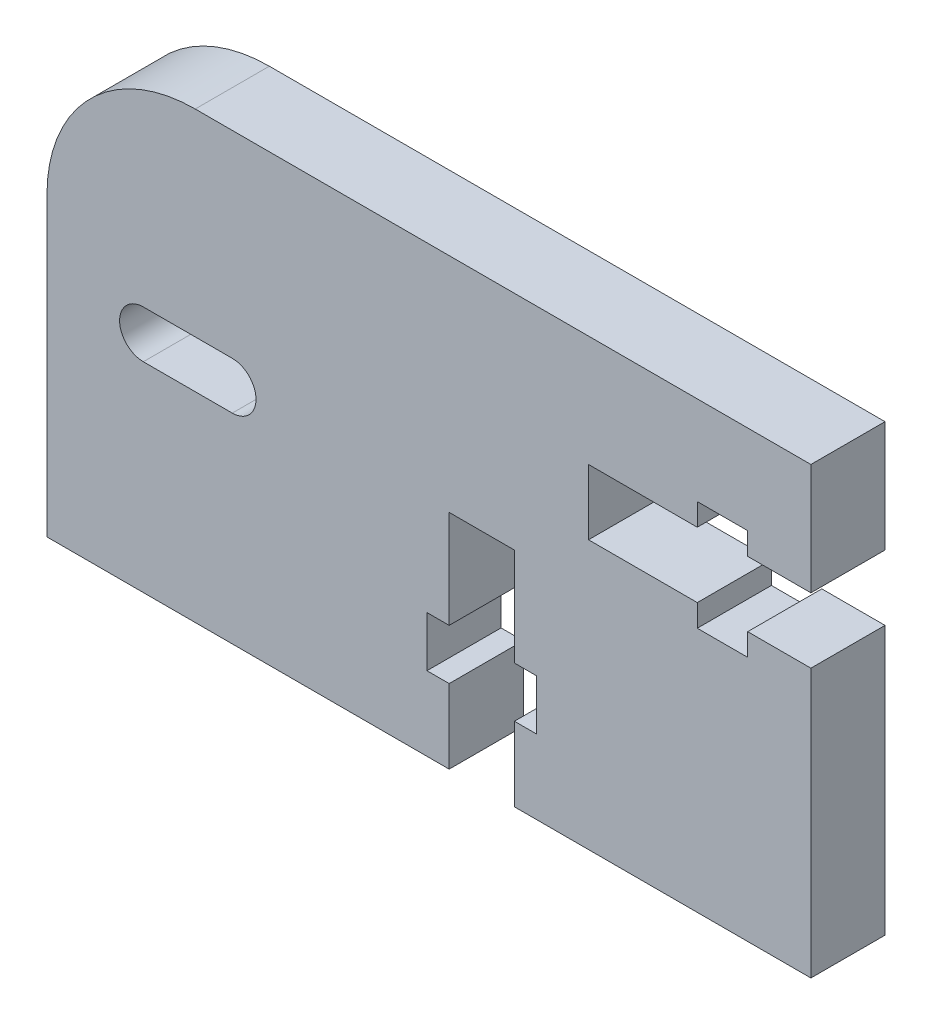
ISO-10303-21;
HEADER;
FILE_DESCRIPTION(('STEP AP214'),'2;1');
FILE_NAME('part.step','',(''),(''),'','','');
FILE_SCHEMA(('AUTOMOTIVE_DESIGN { 1 0 10303 214 1 1 1 1 }'));
ENDSEC;
DATA;
#1=APPLICATION_CONTEXT('core data for automotive mechanical design processes');
#2=APPLICATION_PROTOCOL_DEFINITION('international standard','automotive_design',2000,#1);
#3=PRODUCT_CONTEXT('',#1,'mechanical');
#4=PRODUCT('Part','Part','',(#3));
#5=PRODUCT_RELATED_PRODUCT_CATEGORY('part','',(#4));
#6=PRODUCT_DEFINITION_FORMATION('','',#4);
#7=PRODUCT_DEFINITION_CONTEXT('part definition',#1,'design');
#8=PRODUCT_DEFINITION('design','',#6,#7);
#9=PRODUCT_DEFINITION_SHAPE('','',#8);
#10=(LENGTH_UNIT() NAMED_UNIT(*) SI_UNIT(.MILLI.,.METRE.));
#11=(NAMED_UNIT(*) PLANE_ANGLE_UNIT() SI_UNIT($,.RADIAN.));
#12=(NAMED_UNIT(*) SI_UNIT($,.STERADIAN.) SOLID_ANGLE_UNIT());
#13=UNCERTAINTY_MEASURE_WITH_UNIT(LENGTH_MEASURE(1.E-05),#10,'distance_accuracy_value','');
#14=(GEOMETRIC_REPRESENTATION_CONTEXT(3) GLOBAL_UNCERTAINTY_ASSIGNED_CONTEXT((#13)) GLOBAL_UNIT_ASSIGNED_CONTEXT((#10,
#11,#12)) REPRESENTATION_CONTEXT('',''));
#15=CARTESIAN_POINT('',(0.,0.,0.));
#16=DIRECTION('',(0.,0.,1.));
#17=DIRECTION('',(1.,0.,0.));
#18=AXIS2_PLACEMENT_3D('',#15,#16,#17);
#19=CARTESIAN_POINT('',(-23.,-20.,5.));
#20=DIRECTION('',(0.,1.,0.));
#21=DIRECTION('',(0.,0.,1.));
#22=AXIS2_PLACEMENT_3D('',#19,#20,#21);
#23=PLANE('',#22);
#24=DIRECTION('',(1.,0.,0.));
#25=VECTOR('',#24,1.);
#26=CARTESIAN_POINT('',(-23.,-20.,5.));
#27=LINE('',#26,#25);
#28=CARTESIAN_POINT('',(8.53000000000001,-20.,5.));
#29=VERTEX_POINT('',#28);
#30=CARTESIAN_POINT('',(28.53,-20.,5.));
#31=VERTEX_POINT('',#30);
#32=EDGE_CURVE('E459',#29,#31,#27,.T.);
#33=ORIENTED_EDGE('',*,*,#32,.F.);
#34=DIRECTION('',(0.,0.,1.));
#35=VECTOR('',#34,1.);
#36=CARTESIAN_POINT('',(8.53000000000001,-20.,0.));
#37=LINE('',#36,#35);
#38=CARTESIAN_POINT('',(8.53000000000001,-20.,0.));
#39=VERTEX_POINT('',#38);
#40=EDGE_CURVE('E443',#39,#29,#37,.T.);
#41=ORIENTED_EDGE('',*,*,#40,.F.);
#42=DIRECTION('',(1.,0.,0.));
#43=VECTOR('',#42,1.);
#44=CARTESIAN_POINT('',(-23.,-20.,0.));
#45=LINE('',#44,#43);
#46=CARTESIAN_POINT('',(28.53,-20.,0.));
#47=VERTEX_POINT('',#46);
#48=EDGE_CURVE('E473',#39,#47,#45,.T.);
#49=ORIENTED_EDGE('',*,*,#48,.T.);
#50=DIRECTION('',(0.,0.,-1.));
#51=VECTOR('',#50,1.);
#52=CARTESIAN_POINT('',(28.53,-20.,5.));
#53=LINE('',#52,#51);
#54=EDGE_CURVE('E485',#31,#47,#53,.T.);
#55=ORIENTED_EDGE('',*,*,#54,.F.);
#56=EDGE_LOOP('',(#33,#41,#49,#55));
#57=FACE_BOUND('',#56,.T.);
#58=ADVANCED_FACE('F33',(#57),#23,.F.);
#59=CARTESIAN_POINT('',(28.53,10.,5.));
#60=DIRECTION('',(-1.,0.,0.));
#61=DIRECTION('',(0.,-1.,0.));
#62=AXIS2_PLACEMENT_3D('',#59,#60,#61);
#63=PLANE('',#62);
#64=DIRECTION('',(0.,1.,0.));
#65=VECTOR('',#64,1.);
#66=CARTESIAN_POINT('',(28.53,10.,5.));
#67=LINE('',#66,#65);
#68=CARTESIAN_POINT('',(28.53,2.5,5.));
#69=VERTEX_POINT('',#68);
#70=CARTESIAN_POINT('',(28.53,10.,5.));
#71=VERTEX_POINT('',#70);
#72=EDGE_CURVE('E464',#69,#71,#67,.T.);
#73=ORIENTED_EDGE('',*,*,#72,.F.);
#74=DIRECTION('',(0.,0.,1.));
#75=VECTOR('',#74,1.);
#76=CARTESIAN_POINT('',(28.53,2.5,0.));
#77=LINE('',#76,#75);
#78=CARTESIAN_POINT('',(28.53,2.5,0.));
#79=VERTEX_POINT('',#78);
#80=EDGE_CURVE('E355',#79,#69,#77,.T.);
#81=ORIENTED_EDGE('',*,*,#80,.F.);
#82=DIRECTION('',(0.,1.,0.));
#83=VECTOR('',#82,1.);
#84=CARTESIAN_POINT('',(28.53,10.,0.));
#85=LINE('',#84,#83);
#86=CARTESIAN_POINT('',(28.53,10.,0.));
#87=VERTEX_POINT('',#86);
#88=EDGE_CURVE('E477',#79,#87,#85,.T.);
#89=ORIENTED_EDGE('',*,*,#88,.T.);
#90=DIRECTION('',(0.,0.,-1.));
#91=VECTOR('',#90,1.);
#92=CARTESIAN_POINT('',(28.53,10.,5.));
#93=LINE('',#92,#91);
#94=EDGE_CURVE('E471',#71,#87,#93,.T.);
#95=ORIENTED_EDGE('',*,*,#94,.F.);
#96=EDGE_LOOP('',(#73,#81,#89,#95));
#97=FACE_BOUND('',#96,.T.);
#98=ADVANCED_FACE('F522',(#97),#63,.F.);
#99=CARTESIAN_POINT('',(-23.,10.,5.));
#100=DIRECTION('',(1.,0.,0.));
#101=DIRECTION('',(0.,1.,0.));
#102=AXIS2_PLACEMENT_3D('',#99,#100,#101);
#103=PLANE('',#102);
#104=DIRECTION('',(0.,-1.,0.));
#105=VECTOR('',#104,1.);
#106=CARTESIAN_POINT('',(-23.,10.,5.));
#107=LINE('',#106,#105);
#108=CARTESIAN_POINT('',(-23.,0.,5.));
#109=VERTEX_POINT('',#108);
#110=CARTESIAN_POINT('',(-23.,-20.,5.));
#111=VERTEX_POINT('',#110);
#112=EDGE_CURVE('E457',#109,#111,#107,.T.);
#113=ORIENTED_EDGE('',*,*,#112,.F.);
#114=DIRECTION('',(0.,0.,-1.));
#115=VECTOR('',#114,1.);
#116=CARTESIAN_POINT('',(-23.,0.,5.));
#117=LINE('',#116,#115);
#118=CARTESIAN_POINT('',(-23.,0.,0.));
#119=VERTEX_POINT('',#118);
#120=EDGE_CURVE('E491',#109,#119,#117,.T.);
#121=ORIENTED_EDGE('',*,*,#120,.T.);
#122=DIRECTION('',(0.,-1.,0.));
#123=VECTOR('',#122,1.);
#124=CARTESIAN_POINT('',(-23.,10.,0.));
#125=LINE('',#124,#123);
#126=CARTESIAN_POINT('',(-23.,-20.,0.));
#127=VERTEX_POINT('',#126);
#128=EDGE_CURVE('E346',#119,#127,#125,.T.);
#129=ORIENTED_EDGE('',*,*,#128,.T.);
#130=DIRECTION('',(0.,0.,-1.));
#131=VECTOR('',#130,1.);
#132=CARTESIAN_POINT('',(-23.,-20.,5.));
#133=LINE('',#132,#131);
#134=EDGE_CURVE('E488',#111,#127,#133,.T.);
#135=ORIENTED_EDGE('',*,*,#134,.F.);
#136=EDGE_LOOP('',(#113,#121,#129,#135));
#137=FACE_BOUND('',#136,.T.);
#138=ADVANCED_FACE('F529',(#137),#103,.F.);
#139=CARTESIAN_POINT('',(4.13000000000001,-20.,0.));
#140=VERTEX_POINT('',#139);
#141=EDGE_CURVE('E474',#127,#140,#45,.T.);
#142=ORIENTED_EDGE('',*,*,#141,.T.);
#143=DIRECTION('',(0.,0.,1.));
#144=VECTOR('',#143,1.);
#145=CARTESIAN_POINT('',(4.13000000000001,-20.,0.));
#146=LINE('',#145,#144);
#147=CARTESIAN_POINT('',(4.13000000000001,-20.,5.));
#148=VERTEX_POINT('',#147);
#149=EDGE_CURVE('E445',#140,#148,#146,.T.);
#150=ORIENTED_EDGE('',*,*,#149,.T.);
#151=EDGE_CURVE('E461',#111,#148,#27,.T.);
#152=ORIENTED_EDGE('',*,*,#151,.F.);
#153=ORIENTED_EDGE('',*,*,#134,.T.);
#154=EDGE_LOOP('',(#142,#150,#152,#153));
#155=FACE_BOUND('',#154,.T.);
#156=ADVANCED_FACE('F525',(#155),#23,.F.);
#157=CARTESIAN_POINT('',(28.53,-1.9,0.));
#158=VERTEX_POINT('',#157);
#159=EDGE_CURVE('E478',#47,#158,#85,.T.);
#160=ORIENTED_EDGE('',*,*,#159,.T.);
#161=DIRECTION('',(0.,0.,1.));
#162=VECTOR('',#161,1.);
#163=CARTESIAN_POINT('',(28.53,-1.9,0.));
#164=LINE('',#163,#162);
#165=CARTESIAN_POINT('',(28.53,-1.9,5.));
#166=VERTEX_POINT('',#165);
#167=EDGE_CURVE('E357',#158,#166,#164,.T.);
#168=ORIENTED_EDGE('',*,*,#167,.T.);
#169=EDGE_CURVE('E465',#31,#166,#67,.T.);
#170=ORIENTED_EDGE('',*,*,#169,.F.);
#171=ORIENTED_EDGE('',*,*,#54,.T.);
#172=EDGE_LOOP('',(#160,#168,#170,#171));
#173=FACE_BOUND('',#172,.T.);
#174=ADVANCED_FACE('F532',(#173),#63,.F.);
#175=CARTESIAN_POINT('',(-23.,10.,5.));
#176=DIRECTION('',(0.,-1.,0.));
#177=DIRECTION('',(1.,0.,0.));
#178=AXIS2_PLACEMENT_3D('',#175,#176,#177);
#179=PLANE('',#178);
#180=DIRECTION('',(-1.,0.,0.));
#181=VECTOR('',#180,1.);
#182=CARTESIAN_POINT('',(-23.,10.,0.));
#183=LINE('',#182,#181);
#184=CARTESIAN_POINT('',(-13.,10.,0.));
#185=VERTEX_POINT('',#184);
#186=EDGE_CURVE('E460',#87,#185,#183,.T.);
#187=ORIENTED_EDGE('',*,*,#186,.T.);
#188=DIRECTION('',(0.,0.,-1.));
#189=VECTOR('',#188,1.);
#190=CARTESIAN_POINT('',(-13.,10.,5.));
#191=LINE('',#190,#189);
#192=CARTESIAN_POINT('',(-13.,10.,5.));
#193=VERTEX_POINT('',#192);
#194=EDGE_CURVE('E496',#185,#193,#191,.F.);
#195=ORIENTED_EDGE('',*,*,#194,.T.);
#196=DIRECTION('',(-1.,0.,0.));
#197=VECTOR('',#196,1.);
#198=CARTESIAN_POINT('',(-23.,10.,5.));
#199=LINE('',#198,#197);
#200=EDGE_CURVE('E468',#71,#193,#199,.T.);
#201=ORIENTED_EDGE('',*,*,#200,.F.);
#202=ORIENTED_EDGE('',*,*,#94,.T.);
#203=EDGE_LOOP('',(#187,#195,#201,#202));
#204=FACE_BOUND('',#203,.T.);
#205=ADVANCED_FACE('F540',(#204),#179,.F.);
#206=CARTESIAN_POINT('',(0.,0.,5.));
#207=DIRECTION('',(0.,0.,1.));
#208=DIRECTION('',(1.,0.,0.));
#209=AXIS2_PLACEMENT_3D('',#206,#207,#208);
#210=PLANE('',#209);
#211=CARTESIAN_POINT('',(-16.5008701908531,-4.91452099195338,5.));
#212=DIRECTION('',(0.,0.,1.));
#213=DIRECTION('',(1.,0.,0.));
#214=AXIS2_PLACEMENT_3D('',#211,#212,#213);
#215=CIRCLE('',#214,1.6);
#216=CARTESIAN_POINT('',(-16.5008701908531,-3.31452099195338,5.));
#217=VERTEX_POINT('',#216);
#218=CARTESIAN_POINT('',(-16.5008701908531,-6.51452099195338,5.));
#219=VERTEX_POINT('',#218);
#220=EDGE_CURVE('E48',#217,#219,#215,.T.);
#221=ORIENTED_EDGE('',*,*,#220,.F.);
#222=DIRECTION('',(-1.,0.,0.));
#223=VECTOR('',#222,1.);
#224=CARTESIAN_POINT('',(-16.5008701908531,-3.31452099195338,5.));
#225=LINE('',#224,#223);
#226=CARTESIAN_POINT('',(-10.5008701908531,-3.31452099195338,5.));
#227=VERTEX_POINT('',#226);
#228=EDGE_CURVE('E267',#227,#217,#225,.T.);
#229=ORIENTED_EDGE('',*,*,#228,.F.);
#230=CARTESIAN_POINT('',(-10.5008701908531,-4.91452099195338,5.));
#231=DIRECTION('',(0.,0.,1.));
#232=DIRECTION('',(1.,0.,0.));
#233=AXIS2_PLACEMENT_3D('',#230,#231,#232);
#234=CIRCLE('',#233,1.6);
#235=CARTESIAN_POINT('',(-10.5008701908531,-6.51452099195338,5.));
#236=VERTEX_POINT('',#235);
#237=EDGE_CURVE('E251',#236,#227,#234,.T.);
#238=ORIENTED_EDGE('',*,*,#237,.F.);
#239=DIRECTION('',(1.,0.,0.));
#240=VECTOR('',#239,1.);
#241=CARTESIAN_POINT('',(-16.5008701908531,-6.51452099195338,5.));
#242=LINE('',#241,#240);
#243=EDGE_CURVE('E260',#219,#236,#242,.T.);
#244=ORIENTED_EDGE('',*,*,#243,.F.);
#245=EDGE_LOOP('',(#221,#229,#238,#244));
#246=FACE_BOUND('',#245,.T.);
#247=ORIENTED_EDGE('',*,*,#200,.T.);
#248=CARTESIAN_POINT('',(-13.,0.,5.));
#249=DIRECTION('',(0.,0.,1.));
#250=DIRECTION('',(1.,0.,0.));
#251=AXIS2_PLACEMENT_3D('',#248,#249,#250);
#252=CIRCLE('',#251,10.);
#253=EDGE_CURVE('E498',#193,#109,#252,.T.);
#254=ORIENTED_EDGE('',*,*,#253,.T.);
#255=ORIENTED_EDGE('',*,*,#112,.T.);
#256=ORIENTED_EDGE('',*,*,#151,.T.);
#257=DIRECTION('',(0.,-1.,0.));
#258=VECTOR('',#257,1.);
#259=CARTESIAN_POINT('',(4.13000000000001,-15.,5.));
#260=LINE('',#259,#258);
#261=CARTESIAN_POINT('',(4.13000000000001,-15.,5.));
#262=VERTEX_POINT('',#261);
#263=EDGE_CURVE('E418',#262,#148,#260,.T.);
#264=ORIENTED_EDGE('',*,*,#263,.F.);
#265=DIRECTION('',(1.,0.,0.));
#266=VECTOR('',#265,1.);
#267=CARTESIAN_POINT('',(2.63000000000001,-15.,5.));
#268=LINE('',#267,#266);
#269=CARTESIAN_POINT('',(2.63000000000001,-15.,5.));
#270=VERTEX_POINT('',#269);
#271=EDGE_CURVE('E415',#270,#262,#268,.T.);
#272=ORIENTED_EDGE('',*,*,#271,.F.);
#273=DIRECTION('',(0.,-1.,0.));
#274=VECTOR('',#273,1.);
#275=CARTESIAN_POINT('',(2.63,-11.6,5.));
#276=LINE('',#275,#274);
#277=CARTESIAN_POINT('',(2.63,-11.6,5.));
#278=VERTEX_POINT('',#277);
#279=EDGE_CURVE('E412',#278,#270,#276,.T.);
#280=ORIENTED_EDGE('',*,*,#279,.F.);
#281=DIRECTION('',(-1.,0.,0.));
#282=VECTOR('',#281,1.);
#283=CARTESIAN_POINT('',(4.13000000000001,-11.6,5.));
#284=LINE('',#283,#282);
#285=CARTESIAN_POINT('',(4.13000000000001,-11.6,5.));
#286=VERTEX_POINT('',#285);
#287=EDGE_CURVE('E409',#286,#278,#284,.T.);
#288=ORIENTED_EDGE('',*,*,#287,.F.);
#289=DIRECTION('',(0.,-1.,0.));
#290=VECTOR('',#289,1.);
#291=CARTESIAN_POINT('',(4.13000000000001,-5.,5.));
#292=LINE('',#291,#290);
#293=CARTESIAN_POINT('',(4.13000000000001,-5.,5.));
#294=VERTEX_POINT('',#293);
#295=EDGE_CURVE('E406',#294,#286,#292,.T.);
#296=ORIENTED_EDGE('',*,*,#295,.F.);
#297=DIRECTION('',(-1.,0.,0.));
#298=VECTOR('',#297,1.);
#299=CARTESIAN_POINT('',(4.13000000000001,-5.,5.));
#300=LINE('',#299,#298);
#301=CARTESIAN_POINT('',(8.53000000000001,-5.,5.));
#302=VERTEX_POINT('',#301);
#303=EDGE_CURVE('E274',#302,#294,#300,.T.);
#304=ORIENTED_EDGE('',*,*,#303,.F.);
#305=DIRECTION('',(0.,1.,0.));
#306=VECTOR('',#305,1.);
#307=CARTESIAN_POINT('',(8.53000000000001,-11.6,5.));
#308=LINE('',#307,#306);
#309=CARTESIAN_POINT('',(8.53000000000001,-11.6,5.));
#310=VERTEX_POINT('',#309);
#311=EDGE_CURVE('E373',#310,#302,#308,.T.);
#312=ORIENTED_EDGE('',*,*,#311,.F.);
#313=DIRECTION('',(-1.,0.,0.));
#314=VECTOR('',#313,1.);
#315=CARTESIAN_POINT('',(8.53000000000001,-11.6,5.));
#316=LINE('',#315,#314);
#317=CARTESIAN_POINT('',(10.03,-11.6,5.));
#318=VERTEX_POINT('',#317);
#319=EDGE_CURVE('E429',#318,#310,#316,.T.);
#320=ORIENTED_EDGE('',*,*,#319,.F.);
#321=DIRECTION('',(0.,1.,0.));
#322=VECTOR('',#321,1.);
#323=CARTESIAN_POINT('',(10.03,-11.6,5.));
#324=LINE('',#323,#322);
#325=CARTESIAN_POINT('',(10.03,-15.,5.));
#326=VERTEX_POINT('',#325);
#327=EDGE_CURVE('E426',#326,#318,#324,.T.);
#328=ORIENTED_EDGE('',*,*,#327,.F.);
#329=DIRECTION('',(1.,0.,0.));
#330=VECTOR('',#329,1.);
#331=CARTESIAN_POINT('',(10.03,-15.,5.));
#332=LINE('',#331,#330);
#333=CARTESIAN_POINT('',(8.53000000000001,-15.,5.));
#334=VERTEX_POINT('',#333);
#335=EDGE_CURVE('E423',#334,#326,#332,.T.);
#336=ORIENTED_EDGE('',*,*,#335,.F.);
#337=DIRECTION('',(0.,1.,0.));
#338=VECTOR('',#337,1.);
#339=CARTESIAN_POINT('',(8.53000000000001,-20.,5.));
#340=LINE('',#339,#338);
#341=EDGE_CURVE('E420',#29,#334,#340,.T.);
#342=ORIENTED_EDGE('',*,*,#341,.F.);
#343=ORIENTED_EDGE('',*,*,#32,.T.);
#344=ORIENTED_EDGE('',*,*,#169,.T.);
#345=DIRECTION('',(1.,0.,0.));
#346=VECTOR('',#345,1.);
#347=CARTESIAN_POINT('',(24.2659048732177,-1.9,5.));
#348=LINE('',#347,#346);
#349=CARTESIAN_POINT('',(24.2659048732177,-1.9,5.));
#350=VERTEX_POINT('',#349);
#351=EDGE_CURVE('E328',#350,#166,#348,.T.);
#352=ORIENTED_EDGE('',*,*,#351,.F.);
#353=DIRECTION('',(0.,1.,0.));
#354=VECTOR('',#353,1.);
#355=CARTESIAN_POINT('',(24.2659048732177,-3.4,5.));
#356=LINE('',#355,#354);
#357=CARTESIAN_POINT('',(24.2659048732177,-3.4,5.));
#358=VERTEX_POINT('',#357);
#359=EDGE_CURVE('E325',#358,#350,#356,.T.);
#360=ORIENTED_EDGE('',*,*,#359,.F.);
#361=DIRECTION('',(1.,0.,0.));
#362=VECTOR('',#361,1.);
#363=CARTESIAN_POINT('',(20.8659048732177,-3.4,5.));
#364=LINE('',#363,#362);
#365=CARTESIAN_POINT('',(20.8659048732177,-3.4,5.));
#366=VERTEX_POINT('',#365);
#367=EDGE_CURVE('E322',#366,#358,#364,.T.);
#368=ORIENTED_EDGE('',*,*,#367,.F.);
#369=DIRECTION('',(0.,-1.,0.));
#370=VECTOR('',#369,1.);
#371=CARTESIAN_POINT('',(20.8659048732177,-1.9,5.));
#372=LINE('',#371,#370);
#373=CARTESIAN_POINT('',(20.8659048732177,-1.9,5.));
#374=VERTEX_POINT('',#373);
#375=EDGE_CURVE('E319',#374,#366,#372,.T.);
#376=ORIENTED_EDGE('',*,*,#375,.F.);
#377=DIRECTION('',(1.,0.,0.));
#378=VECTOR('',#377,1.);
#379=CARTESIAN_POINT('',(13.53,-1.9,5.));
#380=LINE('',#379,#378);
#381=CARTESIAN_POINT('',(13.53,-1.9,5.));
#382=VERTEX_POINT('',#381);
#383=EDGE_CURVE('E315',#382,#374,#380,.T.);
#384=ORIENTED_EDGE('',*,*,#383,.F.);
#385=DIRECTION('',(0.,-1.,0.));
#386=VECTOR('',#385,1.);
#387=CARTESIAN_POINT('',(13.53,-1.9,5.));
#388=LINE('',#387,#386);
#389=CARTESIAN_POINT('',(13.53,2.5,5.));
#390=VERTEX_POINT('',#389);
#391=EDGE_CURVE('E312',#390,#382,#388,.T.);
#392=ORIENTED_EDGE('',*,*,#391,.F.);
#393=DIRECTION('',(-1.,0.,0.));
#394=VECTOR('',#393,1.);
#395=CARTESIAN_POINT('',(20.8659048732177,2.5,5.));
#396=LINE('',#395,#394);
#397=CARTESIAN_POINT('',(20.8659048732177,2.5,5.));
#398=VERTEX_POINT('',#397);
#399=EDGE_CURVE('E281',#398,#390,#396,.T.);
#400=ORIENTED_EDGE('',*,*,#399,.F.);
#401=DIRECTION('',(0.,-1.,0.));
#402=VECTOR('',#401,1.);
#403=CARTESIAN_POINT('',(20.8659048732177,2.5,5.));
#404=LINE('',#403,#402);
#405=CARTESIAN_POINT('',(20.8659048732177,4.,5.));
#406=VERTEX_POINT('',#405);
#407=EDGE_CURVE('E339',#406,#398,#404,.T.);
#408=ORIENTED_EDGE('',*,*,#407,.F.);
#409=DIRECTION('',(-1.,0.,0.));
#410=VECTOR('',#409,1.);
#411=CARTESIAN_POINT('',(20.8659048732177,4.,5.));
#412=LINE('',#411,#410);
#413=CARTESIAN_POINT('',(24.2659048732177,4.00000000000001,5.));
#414=VERTEX_POINT('',#413);
#415=EDGE_CURVE('E336',#414,#406,#412,.T.);
#416=ORIENTED_EDGE('',*,*,#415,.F.);
#417=DIRECTION('',(0.,1.,0.));
#418=VECTOR('',#417,1.);
#419=CARTESIAN_POINT('',(24.2659048732177,4.00000000000001,5.));
#420=LINE('',#419,#418);
#421=CARTESIAN_POINT('',(24.2659048732177,2.5,5.));
#422=VERTEX_POINT('',#421);
#423=EDGE_CURVE('E333',#422,#414,#420,.T.);
#424=ORIENTED_EDGE('',*,*,#423,.F.);
#425=DIRECTION('',(-1.,0.,0.));
#426=VECTOR('',#425,1.);
#427=CARTESIAN_POINT('',(28.53,2.5,5.));
#428=LINE('',#427,#426);
#429=EDGE_CURVE('E330',#69,#422,#428,.T.);
#430=ORIENTED_EDGE('',*,*,#429,.F.);
#431=ORIENTED_EDGE('',*,*,#72,.T.);
#432=EDGE_LOOP('',(#247,#254,#255,#256,#264,#272,#280,#288,#296,#304,#312,#320,#328,#336,#342,
#343,#344,#352,#360,#368,#376,#384,#392,#400,#408,#416,#424,#430,#431));
#433=FACE_BOUND('',#432,.T.);
#434=ADVANCED_FACE('F264',(#246,#433),#210,.T.);
#435=CARTESIAN_POINT('',(0.,0.,0.));
#436=DIRECTION('',(0.,0.,1.));
#437=DIRECTION('',(1.,0.,0.));
#438=AXIS2_PLACEMENT_3D('',#435,#436,#437);
#439=PLANE('',#438);
#440=DIRECTION('',(-1.,0.,0.));
#441=VECTOR('',#440,1.);
#442=CARTESIAN_POINT('',(0.,-3.31452099195338,0.));
#443=LINE('',#442,#441);
#444=CARTESIAN_POINT('',(-10.5008701908531,-3.31452099195338,0.));
#445=VERTEX_POINT('',#444);
#446=CARTESIAN_POINT('',(-16.5008701908531,-3.31452099195338,0.));
#447=VERTEX_POINT('',#446);
#448=EDGE_CURVE('E41',#445,#447,#443,.T.);
#449=ORIENTED_EDGE('',*,*,#448,.T.);
#450=CARTESIAN_POINT('',(-16.5008701908531,-4.91452099195338,0.));
#451=DIRECTION('',(0.,0.,1.));
#452=DIRECTION('',(1.,0.,0.));
#453=AXIS2_PLACEMENT_3D('',#450,#451,#452);
#454=CIRCLE('',#453,1.6);
#455=CARTESIAN_POINT('',(-16.5008701908531,-6.51452099195338,0.));
#456=VERTEX_POINT('',#455);
#457=EDGE_CURVE('E11',#447,#456,#454,.T.);
#458=ORIENTED_EDGE('',*,*,#457,.T.);
#459=DIRECTION('',(1.,0.,0.));
#460=VECTOR('',#459,1.);
#461=CARTESIAN_POINT('',(0.,-6.51452099195338,0.));
#462=LINE('',#461,#460);
#463=CARTESIAN_POINT('',(-10.5008701908531,-6.51452099195338,0.));
#464=VERTEX_POINT('',#463);
#465=EDGE_CURVE('E500',#456,#464,#462,.T.);
#466=ORIENTED_EDGE('',*,*,#465,.T.);
#467=CARTESIAN_POINT('',(-10.5008701908531,-4.91452099195338,0.));
#468=DIRECTION('',(0.,0.,1.));
#469=DIRECTION('',(1.,0.,0.));
#470=AXIS2_PLACEMENT_3D('',#467,#468,#469);
#471=CIRCLE('',#470,1.6);
#472=EDGE_CURVE('E254',#464,#445,#471,.T.);
#473=ORIENTED_EDGE('',*,*,#472,.T.);
#474=EDGE_LOOP('',(#449,#458,#466,#473));
#475=FACE_BOUND('',#474,.T.);
#476=ORIENTED_EDGE('',*,*,#128,.F.);
#477=CARTESIAN_POINT('',(-13.,0.,0.));
#478=DIRECTION('',(0.,0.,1.));
#479=DIRECTION('',(1.,0.,0.));
#480=AXIS2_PLACEMENT_3D('',#477,#478,#479);
#481=CIRCLE('',#480,10.);
#482=EDGE_CURVE('E494',#119,#185,#481,.F.);
#483=ORIENTED_EDGE('',*,*,#482,.T.);
#484=ORIENTED_EDGE('',*,*,#186,.F.);
#485=ORIENTED_EDGE('',*,*,#88,.F.);
#486=DIRECTION('',(-1.,0.,0.));
#487=VECTOR('',#486,1.);
#488=CARTESIAN_POINT('',(28.53,2.5,0.));
#489=LINE('',#488,#487);
#490=CARTESIAN_POINT('',(24.2659048732177,2.5,0.));
#491=VERTEX_POINT('',#490);
#492=EDGE_CURVE('E296',#79,#491,#489,.T.);
#493=ORIENTED_EDGE('',*,*,#492,.T.);
#494=DIRECTION('',(0.,1.,0.));
#495=VECTOR('',#494,1.);
#496=CARTESIAN_POINT('',(24.2659048732177,4.00000000000001,0.));
#497=LINE('',#496,#495);
#498=CARTESIAN_POINT('',(24.2659048732177,4.00000000000001,0.));
#499=VERTEX_POINT('',#498);
#500=EDGE_CURVE('E299',#491,#499,#497,.T.);
#501=ORIENTED_EDGE('',*,*,#500,.T.);
#502=DIRECTION('',(-1.,0.,0.));
#503=VECTOR('',#502,1.);
#504=CARTESIAN_POINT('',(20.8659048732177,4.,0.));
#505=LINE('',#504,#503);
#506=CARTESIAN_POINT('',(20.8659048732177,4.,0.));
#507=VERTEX_POINT('',#506);
#508=EDGE_CURVE('E302',#499,#507,#505,.T.);
#509=ORIENTED_EDGE('',*,*,#508,.T.);
#510=DIRECTION('',(0.,-1.,0.));
#511=VECTOR('',#510,1.);
#512=CARTESIAN_POINT('',(20.8659048732177,2.5,0.));
#513=LINE('',#512,#511);
#514=CARTESIAN_POINT('',(20.8659048732177,2.5,0.));
#515=VERTEX_POINT('',#514);
#516=EDGE_CURVE('E305',#507,#515,#513,.T.);
#517=ORIENTED_EDGE('',*,*,#516,.T.);
#518=DIRECTION('',(-1.,0.,0.));
#519=VECTOR('',#518,1.);
#520=CARTESIAN_POINT('',(20.8659048732177,2.5,0.));
#521=LINE('',#520,#519);
#522=CARTESIAN_POINT('',(13.53,2.5,0.));
#523=VERTEX_POINT('',#522);
#524=EDGE_CURVE('E308',#515,#523,#521,.T.);
#525=ORIENTED_EDGE('',*,*,#524,.T.);
#526=DIRECTION('',(0.,-1.,0.));
#527=VECTOR('',#526,1.);
#528=CARTESIAN_POINT('',(13.53,-1.9,0.));
#529=LINE('',#528,#527);
#530=CARTESIAN_POINT('',(13.53,-1.9,0.));
#531=VERTEX_POINT('',#530);
#532=EDGE_CURVE('E277',#523,#531,#529,.T.);
#533=ORIENTED_EDGE('',*,*,#532,.T.);
#534=DIRECTION('',(1.,0.,0.));
#535=VECTOR('',#534,1.);
#536=CARTESIAN_POINT('',(13.53,-1.9,0.));
#537=LINE('',#536,#535);
#538=CARTESIAN_POINT('',(20.8659048732177,-1.9,0.));
#539=VERTEX_POINT('',#538);
#540=EDGE_CURVE('E280',#531,#539,#537,.T.);
#541=ORIENTED_EDGE('',*,*,#540,.T.);
#542=DIRECTION('',(0.,-1.,0.));
#543=VECTOR('',#542,1.);
#544=CARTESIAN_POINT('',(20.8659048732177,-1.9,0.));
#545=LINE('',#544,#543);
#546=CARTESIAN_POINT('',(20.8659048732177,-3.4,0.));
#547=VERTEX_POINT('',#546);
#548=EDGE_CURVE('E284',#539,#547,#545,.T.);
#549=ORIENTED_EDGE('',*,*,#548,.T.);
#550=DIRECTION('',(1.,0.,0.));
#551=VECTOR('',#550,1.);
#552=CARTESIAN_POINT('',(20.8659048732177,-3.4,0.));
#553=LINE('',#552,#551);
#554=CARTESIAN_POINT('',(24.2659048732177,-3.4,0.));
#555=VERTEX_POINT('',#554);
#556=EDGE_CURVE('E287',#547,#555,#553,.T.);
#557=ORIENTED_EDGE('',*,*,#556,.T.);
#558=DIRECTION('',(0.,1.,0.));
#559=VECTOR('',#558,1.);
#560=CARTESIAN_POINT('',(24.2659048732177,-3.4,0.));
#561=LINE('',#560,#559);
#562=CARTESIAN_POINT('',(24.2659048732177,-1.9,0.));
#563=VERTEX_POINT('',#562);
#564=EDGE_CURVE('E290',#555,#563,#561,.T.);
#565=ORIENTED_EDGE('',*,*,#564,.T.);
#566=DIRECTION('',(1.,0.,0.));
#567=VECTOR('',#566,1.);
#568=CARTESIAN_POINT('',(24.2659048732177,-1.9,0.));
#569=LINE('',#568,#567);
#570=EDGE_CURVE('E293',#563,#158,#569,.T.);
#571=ORIENTED_EDGE('',*,*,#570,.T.);
#572=ORIENTED_EDGE('',*,*,#159,.F.);
#573=ORIENTED_EDGE('',*,*,#48,.F.);
#574=DIRECTION('',(0.,1.,0.));
#575=VECTOR('',#574,1.);
#576=CARTESIAN_POINT('',(8.53000000000001,-20.,0.));
#577=LINE('',#576,#575);
#578=CARTESIAN_POINT('',(8.53000000000001,-15.,0.));
#579=VERTEX_POINT('',#578);
#580=EDGE_CURVE('E388',#39,#579,#577,.T.);
#581=ORIENTED_EDGE('',*,*,#580,.T.);
#582=DIRECTION('',(1.,0.,0.));
#583=VECTOR('',#582,1.);
#584=CARTESIAN_POINT('',(10.03,-15.,0.));
#585=LINE('',#584,#583);
#586=CARTESIAN_POINT('',(10.03,-15.,0.));
#587=VERTEX_POINT('',#586);
#588=EDGE_CURVE('E391',#579,#587,#585,.T.);
#589=ORIENTED_EDGE('',*,*,#588,.T.);
#590=DIRECTION('',(0.,1.,0.));
#591=VECTOR('',#590,1.);
#592=CARTESIAN_POINT('',(10.03,-11.6,0.));
#593=LINE('',#592,#591);
#594=CARTESIAN_POINT('',(10.03,-11.6,0.));
#595=VERTEX_POINT('',#594);
#596=EDGE_CURVE('E394',#587,#595,#593,.T.);
#597=ORIENTED_EDGE('',*,*,#596,.T.);
#598=DIRECTION('',(-1.,0.,0.));
#599=VECTOR('',#598,1.);
#600=CARTESIAN_POINT('',(8.53000000000001,-11.6,0.));
#601=LINE('',#600,#599);
#602=CARTESIAN_POINT('',(8.53000000000001,-11.6,0.));
#603=VERTEX_POINT('',#602);
#604=EDGE_CURVE('E397',#595,#603,#601,.T.);
#605=ORIENTED_EDGE('',*,*,#604,.T.);
#606=DIRECTION('',(0.,1.,0.));
#607=VECTOR('',#606,1.);
#608=CARTESIAN_POINT('',(8.53000000000001,-11.6,0.));
#609=LINE('',#608,#607);
#610=CARTESIAN_POINT('',(8.53000000000001,-5.,0.));
#611=VERTEX_POINT('',#610);
#612=EDGE_CURVE('E400',#603,#611,#609,.T.);
#613=ORIENTED_EDGE('',*,*,#612,.T.);
#614=DIRECTION('',(-1.,0.,0.));
#615=VECTOR('',#614,1.);
#616=CARTESIAN_POINT('',(4.13000000000001,-5.,0.));
#617=LINE('',#616,#615);
#618=CARTESIAN_POINT('',(4.13000000000001,-5.,0.));
#619=VERTEX_POINT('',#618);
#620=EDGE_CURVE('E369',#611,#619,#617,.T.);
#621=ORIENTED_EDGE('',*,*,#620,.T.);
#622=DIRECTION('',(0.,-1.,0.));
#623=VECTOR('',#622,1.);
#624=CARTESIAN_POINT('',(4.13000000000001,-5.,0.));
#625=LINE('',#624,#623);
#626=CARTESIAN_POINT('',(4.13000000000001,-11.6,0.));
#627=VERTEX_POINT('',#626);
#628=EDGE_CURVE('E372',#619,#627,#625,.T.);
#629=ORIENTED_EDGE('',*,*,#628,.T.);
#630=DIRECTION('',(-1.,0.,0.));
#631=VECTOR('',#630,1.);
#632=CARTESIAN_POINT('',(4.13000000000001,-11.6,0.));
#633=LINE('',#632,#631);
#634=CARTESIAN_POINT('',(2.63,-11.6,0.));
#635=VERTEX_POINT('',#634);
#636=EDGE_CURVE('E376',#627,#635,#633,.T.);
#637=ORIENTED_EDGE('',*,*,#636,.T.);
#638=DIRECTION('',(0.,-1.,0.));
#639=VECTOR('',#638,1.);
#640=CARTESIAN_POINT('',(2.63,-11.6,0.));
#641=LINE('',#640,#639);
#642=CARTESIAN_POINT('',(2.63000000000001,-15.,0.));
#643=VERTEX_POINT('',#642);
#644=EDGE_CURVE('E379',#635,#643,#641,.T.);
#645=ORIENTED_EDGE('',*,*,#644,.T.);
#646=DIRECTION('',(1.,0.,0.));
#647=VECTOR('',#646,1.);
#648=CARTESIAN_POINT('',(2.63000000000001,-15.,0.));
#649=LINE('',#648,#647);
#650=CARTESIAN_POINT('',(4.13000000000001,-15.,0.));
#651=VERTEX_POINT('',#650);
#652=EDGE_CURVE('E382',#643,#651,#649,.T.);
#653=ORIENTED_EDGE('',*,*,#652,.T.);
#654=DIRECTION('',(0.,-1.,0.));
#655=VECTOR('',#654,1.);
#656=CARTESIAN_POINT('',(4.13000000000001,-15.,0.));
#657=LINE('',#656,#655);
#658=EDGE_CURVE('E385',#651,#140,#657,.T.);
#659=ORIENTED_EDGE('',*,*,#658,.T.);
#660=ORIENTED_EDGE('',*,*,#141,.F.);
#661=EDGE_LOOP('',(#476,#483,#484,#485,#493,#501,#509,#517,#525,#533,#541,#549,#557,#565,#571,
#572,#573,#581,#589,#597,#605,#613,#621,#629,#637,#645,#653,#659,#660));
#662=FACE_BOUND('',#661,.T.);
#663=ADVANCED_FACE('F504',(#475,#662),#439,.F.);
#664=CARTESIAN_POINT('',(4.13000000000001,-5.,0.));
#665=DIRECTION('',(0.,1.,0.));
#666=DIRECTION('',(0.,0.,1.));
#667=AXIS2_PLACEMENT_3D('',#664,#665,#666);
#668=PLANE('',#667);
#669=ORIENTED_EDGE('',*,*,#303,.T.);
#670=DIRECTION('',(0.,0.,1.));
#671=VECTOR('',#670,1.);
#672=CARTESIAN_POINT('',(4.13000000000001,-5.,0.));
#673=LINE('',#672,#671);
#674=EDGE_CURVE('E403',#619,#294,#673,.T.);
#675=ORIENTED_EDGE('',*,*,#674,.F.);
#676=ORIENTED_EDGE('',*,*,#620,.F.);
#677=DIRECTION('',(0.,0.,1.));
#678=VECTOR('',#677,1.);
#679=CARTESIAN_POINT('',(8.53000000000001,-5.,0.));
#680=LINE('',#679,#678);
#681=EDGE_CURVE('E316',#611,#302,#680,.T.);
#682=ORIENTED_EDGE('',*,*,#681,.T.);
#683=EDGE_LOOP('',(#669,#675,#676,#682));
#684=FACE_BOUND('',#683,.T.);
#685=ADVANCED_FACE('F634',(#684),#668,.F.);
#686=CARTESIAN_POINT('',(8.53000000000001,-11.6,0.));
#687=DIRECTION('',(1.,0.,0.));
#688=DIRECTION('',(0.,1.,0.));
#689=AXIS2_PLACEMENT_3D('',#686,#687,#688);
#690=PLANE('',#689);
#691=ORIENTED_EDGE('',*,*,#311,.T.);
#692=ORIENTED_EDGE('',*,*,#681,.F.);
#693=ORIENTED_EDGE('',*,*,#612,.F.);
#694=DIRECTION('',(0.,0.,1.));
#695=VECTOR('',#694,1.);
#696=CARTESIAN_POINT('',(8.53000000000001,-11.6,0.));
#697=LINE('',#696,#695);
#698=EDGE_CURVE('E435',#603,#310,#697,.T.);
#699=ORIENTED_EDGE('',*,*,#698,.T.);
#700=EDGE_LOOP('',(#691,#692,#693,#699));
#701=FACE_BOUND('',#700,.T.);
#702=ADVANCED_FACE('F630',(#701),#690,.F.);
#703=CARTESIAN_POINT('',(8.53000000000001,-11.6,0.));
#704=DIRECTION('',(0.,1.,0.));
#705=DIRECTION('',(0.,0.,1.));
#706=AXIS2_PLACEMENT_3D('',#703,#704,#705);
#707=PLANE('',#706);
#708=ORIENTED_EDGE('',*,*,#319,.T.);
#709=ORIENTED_EDGE('',*,*,#698,.F.);
#710=ORIENTED_EDGE('',*,*,#604,.F.);
#711=DIRECTION('',(0.,0.,1.));
#712=VECTOR('',#711,1.);
#713=CARTESIAN_POINT('',(10.03,-11.6,0.));
#714=LINE('',#713,#712);
#715=EDGE_CURVE('E437',#595,#318,#714,.T.);
#716=ORIENTED_EDGE('',*,*,#715,.T.);
#717=EDGE_LOOP('',(#708,#709,#710,#716));
#718=FACE_BOUND('',#717,.T.);
#719=ADVANCED_FACE('F626',(#718),#707,.F.);
#720=CARTESIAN_POINT('',(10.03,-11.6,0.));
#721=DIRECTION('',(1.,0.,0.));
#722=DIRECTION('',(0.,1.,0.));
#723=AXIS2_PLACEMENT_3D('',#720,#721,#722);
#724=PLANE('',#723);
#725=ORIENTED_EDGE('',*,*,#327,.T.);
#726=ORIENTED_EDGE('',*,*,#715,.F.);
#727=ORIENTED_EDGE('',*,*,#596,.F.);
#728=DIRECTION('',(0.,0.,1.));
#729=VECTOR('',#728,1.);
#730=CARTESIAN_POINT('',(10.03,-15.,0.));
#731=LINE('',#730,#729);
#732=EDGE_CURVE('E439',#587,#326,#731,.T.);
#733=ORIENTED_EDGE('',*,*,#732,.T.);
#734=EDGE_LOOP('',(#725,#726,#727,#733));
#735=FACE_BOUND('',#734,.T.);
#736=ADVANCED_FACE('F622',(#735),#724,.F.);
#737=CARTESIAN_POINT('',(10.03,-15.,0.));
#738=DIRECTION('',(0.,-1.,0.));
#739=DIRECTION('',(0.,0.,-1.));
#740=AXIS2_PLACEMENT_3D('',#737,#738,#739);
#741=PLANE('',#740);
#742=ORIENTED_EDGE('',*,*,#335,.T.);
#743=ORIENTED_EDGE('',*,*,#732,.F.);
#744=ORIENTED_EDGE('',*,*,#588,.F.);
#745=DIRECTION('',(0.,0.,1.));
#746=VECTOR('',#745,1.);
#747=CARTESIAN_POINT('',(8.53000000000001,-15.,0.));
#748=LINE('',#747,#746);
#749=EDGE_CURVE('E441',#579,#334,#748,.T.);
#750=ORIENTED_EDGE('',*,*,#749,.T.);
#751=EDGE_LOOP('',(#742,#743,#744,#750));
#752=FACE_BOUND('',#751,.T.);
#753=ADVANCED_FACE('F618',(#752),#741,.F.);
#754=CARTESIAN_POINT('',(8.53000000000001,-20.,0.));
#755=DIRECTION('',(1.,0.,0.));
#756=DIRECTION('',(0.,0.,-1.));
#757=AXIS2_PLACEMENT_3D('',#754,#755,#756);
#758=PLANE('',#757);
#759=ORIENTED_EDGE('',*,*,#341,.T.);
#760=ORIENTED_EDGE('',*,*,#749,.F.);
#761=ORIENTED_EDGE('',*,*,#580,.F.);
#762=ORIENTED_EDGE('',*,*,#40,.T.);
#763=EDGE_LOOP('',(#759,#760,#761,#762));
#764=FACE_BOUND('',#763,.T.);
#765=ADVANCED_FACE('F616',(#764),#758,.F.);
#766=CARTESIAN_POINT('',(4.13000000000001,-15.,0.));
#767=DIRECTION('',(-1.,0.,0.));
#768=DIRECTION('',(0.,-1.,0.));
#769=AXIS2_PLACEMENT_3D('',#766,#767,#768);
#770=PLANE('',#769);
#771=ORIENTED_EDGE('',*,*,#263,.T.);
#772=ORIENTED_EDGE('',*,*,#149,.F.);
#773=ORIENTED_EDGE('',*,*,#658,.F.);
#774=DIRECTION('',(0.,0.,1.));
#775=VECTOR('',#774,1.);
#776=CARTESIAN_POINT('',(4.13000000000001,-15.,0.));
#777=LINE('',#776,#775);
#778=EDGE_CURVE('E448',#651,#262,#777,.T.);
#779=ORIENTED_EDGE('',*,*,#778,.T.);
#780=EDGE_LOOP('',(#771,#772,#773,#779));
#781=FACE_BOUND('',#780,.T.);
#782=ADVANCED_FACE('F550',(#781),#770,.F.);
#783=CARTESIAN_POINT('',(2.63000000000001,-15.,0.));
#784=DIRECTION('',(0.,-1.,0.));
#785=DIRECTION('',(0.,0.,-1.));
#786=AXIS2_PLACEMENT_3D('',#783,#784,#785);
#787=PLANE('',#786);
#788=ORIENTED_EDGE('',*,*,#271,.T.);
#789=ORIENTED_EDGE('',*,*,#778,.F.);
#790=ORIENTED_EDGE('',*,*,#652,.F.);
#791=DIRECTION('',(0.,0.,1.));
#792=VECTOR('',#791,1.);
#793=CARTESIAN_POINT('',(2.63000000000001,-15.,0.));
#794=LINE('',#793,#792);
#795=EDGE_CURVE('E450',#643,#270,#794,.T.);
#796=ORIENTED_EDGE('',*,*,#795,.T.);
#797=EDGE_LOOP('',(#788,#789,#790,#796));
#798=FACE_BOUND('',#797,.T.);
#799=ADVANCED_FACE('F647',(#798),#787,.F.);
#800=CARTESIAN_POINT('',(2.63,-11.6,0.));
#801=DIRECTION('',(-1.,0.,0.));
#802=DIRECTION('',(0.,-1.,0.));
#803=AXIS2_PLACEMENT_3D('',#800,#801,#802);
#804=PLANE('',#803);
#805=ORIENTED_EDGE('',*,*,#279,.T.);
#806=ORIENTED_EDGE('',*,*,#795,.F.);
#807=ORIENTED_EDGE('',*,*,#644,.F.);
#808=DIRECTION('',(0.,0.,1.));
#809=VECTOR('',#808,1.);
#810=CARTESIAN_POINT('',(2.63,-11.6,0.));
#811=LINE('',#810,#809);
#812=EDGE_CURVE('E452',#635,#278,#811,.T.);
#813=ORIENTED_EDGE('',*,*,#812,.T.);
#814=EDGE_LOOP('',(#805,#806,#807,#813));
#815=FACE_BOUND('',#814,.T.);
#816=ADVANCED_FACE('F645',(#815),#804,.F.);
#817=CARTESIAN_POINT('',(4.13000000000001,-11.6,0.));
#818=DIRECTION('',(0.,1.,0.));
#819=DIRECTION('',(-1.,0.,0.));
#820=AXIS2_PLACEMENT_3D('',#817,#818,#819);
#821=PLANE('',#820);
#822=ORIENTED_EDGE('',*,*,#287,.T.);
#823=ORIENTED_EDGE('',*,*,#812,.F.);
#824=ORIENTED_EDGE('',*,*,#636,.F.);
#825=DIRECTION('',(0.,0.,1.));
#826=VECTOR('',#825,1.);
#827=CARTESIAN_POINT('',(4.13000000000001,-11.6,0.));
#828=LINE('',#827,#826);
#829=EDGE_CURVE('E454',#627,#286,#828,.T.);
#830=ORIENTED_EDGE('',*,*,#829,.T.);
#831=EDGE_LOOP('',(#822,#823,#824,#830));
#832=FACE_BOUND('',#831,.T.);
#833=ADVANCED_FACE('F642',(#832),#821,.F.);
#834=CARTESIAN_POINT('',(4.13000000000001,-5.,0.));
#835=DIRECTION('',(-1.,0.,0.));
#836=DIRECTION('',(0.,-1.,0.));
#837=AXIS2_PLACEMENT_3D('',#834,#835,#836);
#838=PLANE('',#837);
#839=ORIENTED_EDGE('',*,*,#295,.T.);
#840=ORIENTED_EDGE('',*,*,#829,.F.);
#841=ORIENTED_EDGE('',*,*,#628,.F.);
#842=ORIENTED_EDGE('',*,*,#674,.T.);
#843=EDGE_LOOP('',(#839,#840,#841,#842));
#844=FACE_BOUND('',#843,.T.);
#845=ADVANCED_FACE('F638',(#844),#838,.F.);
#846=CARTESIAN_POINT('',(13.53,-1.9,0.));
#847=DIRECTION('',(-1.,0.,0.));
#848=DIRECTION('',(0.,0.,1.));
#849=AXIS2_PLACEMENT_3D('',#846,#847,#848);
#850=PLANE('',#849);
#851=ORIENTED_EDGE('',*,*,#391,.T.);
#852=DIRECTION('',(0.,0.,1.));
#853=VECTOR('',#852,1.);
#854=CARTESIAN_POINT('',(13.53,-1.9,0.));
#855=LINE('',#854,#853);
#856=EDGE_CURVE('E311',#531,#382,#855,.T.);
#857=ORIENTED_EDGE('',*,*,#856,.F.);
#858=ORIENTED_EDGE('',*,*,#532,.F.);
#859=DIRECTION('',(0.,0.,1.));
#860=VECTOR('',#859,1.);
#861=CARTESIAN_POINT('',(13.53,2.5,0.));
#862=LINE('',#861,#860);
#863=EDGE_CURVE('E344',#523,#390,#862,.T.);
#864=ORIENTED_EDGE('',*,*,#863,.T.);
#865=EDGE_LOOP('',(#851,#857,#858,#864));
#866=FACE_BOUND('',#865,.T.);
#867=ADVANCED_FACE('F587',(#866),#850,.F.);
#868=CARTESIAN_POINT('',(20.8659048732177,2.5,0.));
#869=DIRECTION('',(0.,1.,0.));
#870=DIRECTION('',(0.,0.,1.));
#871=AXIS2_PLACEMENT_3D('',#868,#869,#870);
#872=PLANE('',#871);
#873=ORIENTED_EDGE('',*,*,#399,.T.);
#874=ORIENTED_EDGE('',*,*,#863,.F.);
#875=ORIENTED_EDGE('',*,*,#524,.F.);
#876=DIRECTION('',(0.,0.,1.));
#877=VECTOR('',#876,1.);
#878=CARTESIAN_POINT('',(20.8659048732177,2.5,0.));
#879=LINE('',#878,#877);
#880=EDGE_CURVE('E347',#515,#398,#879,.T.);
#881=ORIENTED_EDGE('',*,*,#880,.T.);
#882=EDGE_LOOP('',(#873,#874,#875,#881));
#883=FACE_BOUND('',#882,.T.);
#884=ADVANCED_FACE('F583',(#883),#872,.F.);
#885=CARTESIAN_POINT('',(20.8659048732177,2.5,0.));
#886=DIRECTION('',(-1.,0.,0.));
#887=DIRECTION('',(0.,0.,1.));
#888=AXIS2_PLACEMENT_3D('',#885,#886,#887);
#889=PLANE('',#888);
#890=ORIENTED_EDGE('',*,*,#407,.T.);
#891=ORIENTED_EDGE('',*,*,#880,.F.);
#892=ORIENTED_EDGE('',*,*,#516,.F.);
#893=DIRECTION('',(0.,0.,1.));
#894=VECTOR('',#893,1.);
#895=CARTESIAN_POINT('',(20.8659048732177,4.,0.));
#896=LINE('',#895,#894);
#897=EDGE_CURVE('E349',#507,#406,#896,.T.);
#898=ORIENTED_EDGE('',*,*,#897,.T.);
#899=EDGE_LOOP('',(#890,#891,#892,#898));
#900=FACE_BOUND('',#899,.T.);
#901=ADVANCED_FACE('F579',(#900),#889,.F.);
#902=CARTESIAN_POINT('',(20.8659048732177,4.,0.));
#903=DIRECTION('',(0.,1.,0.));
#904=DIRECTION('',(-1.,0.,0.));
#905=AXIS2_PLACEMENT_3D('',#902,#903,#904);
#906=PLANE('',#905);
#907=ORIENTED_EDGE('',*,*,#415,.T.);
#908=ORIENTED_EDGE('',*,*,#897,.F.);
#909=ORIENTED_EDGE('',*,*,#508,.F.);
#910=DIRECTION('',(0.,0.,1.));
#911=VECTOR('',#910,1.);
#912=CARTESIAN_POINT('',(24.2659048732177,4.00000000000001,0.));
#913=LINE('',#912,#911);
#914=EDGE_CURVE('E351',#499,#414,#913,.T.);
#915=ORIENTED_EDGE('',*,*,#914,.T.);
#916=EDGE_LOOP('',(#907,#908,#909,#915));
#917=FACE_BOUND('',#916,.T.);
#918=ADVANCED_FACE('F575',(#917),#906,.F.);
#919=CARTESIAN_POINT('',(24.2659048732177,4.00000000000001,0.));
#920=DIRECTION('',(1.,0.,0.));
#921=DIRECTION('',(0.,0.,-1.));
#922=AXIS2_PLACEMENT_3D('',#919,#920,#921);
#923=PLANE('',#922);
#924=ORIENTED_EDGE('',*,*,#423,.T.);
#925=ORIENTED_EDGE('',*,*,#914,.F.);
#926=ORIENTED_EDGE('',*,*,#500,.F.);
#927=DIRECTION('',(0.,0.,1.));
#928=VECTOR('',#927,1.);
#929=CARTESIAN_POINT('',(24.2659048732177,2.5,0.));
#930=LINE('',#929,#928);
#931=EDGE_CURVE('E353',#491,#422,#930,.T.);
#932=ORIENTED_EDGE('',*,*,#931,.T.);
#933=EDGE_LOOP('',(#924,#925,#926,#932));
#934=FACE_BOUND('',#933,.T.);
#935=ADVANCED_FACE('F571',(#934),#923,.F.);
#936=CARTESIAN_POINT('',(28.53,2.5,0.));
#937=DIRECTION('',(0.,1.,0.));
#938=DIRECTION('',(0.,0.,1.));
#939=AXIS2_PLACEMENT_3D('',#936,#937,#938);
#940=PLANE('',#939);
#941=ORIENTED_EDGE('',*,*,#429,.T.);
#942=ORIENTED_EDGE('',*,*,#931,.F.);
#943=ORIENTED_EDGE('',*,*,#492,.F.);
#944=ORIENTED_EDGE('',*,*,#80,.T.);
#945=EDGE_LOOP('',(#941,#942,#943,#944));
#946=FACE_BOUND('',#945,.T.);
#947=ADVANCED_FACE('F567',(#946),#940,.F.);
#948=CARTESIAN_POINT('',(24.2659048732177,-1.9,0.));
#949=DIRECTION('',(0.,-1.,0.));
#950=DIRECTION('',(1.,0.,0.));
#951=AXIS2_PLACEMENT_3D('',#948,#949,#950);
#952=PLANE('',#951);
#953=ORIENTED_EDGE('',*,*,#351,.T.);
#954=ORIENTED_EDGE('',*,*,#167,.F.);
#955=ORIENTED_EDGE('',*,*,#570,.F.);
#956=DIRECTION('',(0.,0.,1.));
#957=VECTOR('',#956,1.);
#958=CARTESIAN_POINT('',(24.2659048732177,-1.9,0.));
#959=LINE('',#958,#957);
#960=EDGE_CURVE('E360',#563,#350,#959,.T.);
#961=ORIENTED_EDGE('',*,*,#960,.T.);
#962=EDGE_LOOP('',(#953,#954,#955,#961));
#963=FACE_BOUND('',#962,.T.);
#964=ADVANCED_FACE('F607',(#963),#952,.F.);
#965=CARTESIAN_POINT('',(24.2659048732177,-3.4,0.));
#966=DIRECTION('',(1.,0.,0.));
#967=DIRECTION('',(0.,0.,-1.));
#968=AXIS2_PLACEMENT_3D('',#965,#966,#967);
#969=PLANE('',#968);
#970=ORIENTED_EDGE('',*,*,#359,.T.);
#971=ORIENTED_EDGE('',*,*,#960,.F.);
#972=ORIENTED_EDGE('',*,*,#564,.F.);
#973=DIRECTION('',(0.,0.,1.));
#974=VECTOR('',#973,1.);
#975=CARTESIAN_POINT('',(24.2659048732177,-3.4,0.));
#976=LINE('',#975,#974);
#977=EDGE_CURVE('E362',#555,#358,#976,.T.);
#978=ORIENTED_EDGE('',*,*,#977,.T.);
#979=EDGE_LOOP('',(#970,#971,#972,#978));
#980=FACE_BOUND('',#979,.T.);
#981=ADVANCED_FACE('F603',(#980),#969,.F.);
#982=CARTESIAN_POINT('',(20.8659048732177,-3.4,0.));
#983=DIRECTION('',(0.,-1.,0.));
#984=DIRECTION('',(1.,0.,0.));
#985=AXIS2_PLACEMENT_3D('',#982,#983,#984);
#986=PLANE('',#985);
#987=ORIENTED_EDGE('',*,*,#367,.T.);
#988=ORIENTED_EDGE('',*,*,#977,.F.);
#989=ORIENTED_EDGE('',*,*,#556,.F.);
#990=DIRECTION('',(0.,0.,1.));
#991=VECTOR('',#990,1.);
#992=CARTESIAN_POINT('',(20.8659048732177,-3.4,0.));
#993=LINE('',#992,#991);
#994=EDGE_CURVE('E364',#547,#366,#993,.T.);
#995=ORIENTED_EDGE('',*,*,#994,.T.);
#996=EDGE_LOOP('',(#987,#988,#989,#995));
#997=FACE_BOUND('',#996,.T.);
#998=ADVANCED_FACE('F598',(#997),#986,.F.);
#999=CARTESIAN_POINT('',(20.8659048732177,-1.9,0.));
#1000=DIRECTION('',(-1.,0.,0.));
#1001=DIRECTION('',(0.,0.,1.));
#1002=AXIS2_PLACEMENT_3D('',#999,#1000,#1001);
#1003=PLANE('',#1002);
#1004=ORIENTED_EDGE('',*,*,#375,.T.);
#1005=ORIENTED_EDGE('',*,*,#994,.F.);
#1006=ORIENTED_EDGE('',*,*,#548,.F.);
#1007=DIRECTION('',(0.,0.,1.));
#1008=VECTOR('',#1007,1.);
#1009=CARTESIAN_POINT('',(20.8659048732177,-1.9,0.));
#1010=LINE('',#1009,#1008);
#1011=EDGE_CURVE('E366',#539,#374,#1010,.T.);
#1012=ORIENTED_EDGE('',*,*,#1011,.T.);
#1013=EDGE_LOOP('',(#1004,#1005,#1006,#1012));
#1014=FACE_BOUND('',#1013,.T.);
#1015=ADVANCED_FACE('F594',(#1014),#1003,.F.);
#1016=CARTESIAN_POINT('',(13.53,-1.9,0.));
#1017=DIRECTION('',(0.,-1.,0.));
#1018=DIRECTION('',(1.,0.,0.));
#1019=AXIS2_PLACEMENT_3D('',#1016,#1017,#1018);
#1020=PLANE('',#1019);
#1021=ORIENTED_EDGE('',*,*,#383,.T.);
#1022=ORIENTED_EDGE('',*,*,#1011,.F.);
#1023=ORIENTED_EDGE('',*,*,#540,.F.);
#1024=ORIENTED_EDGE('',*,*,#856,.T.);
#1025=EDGE_LOOP('',(#1021,#1022,#1023,#1024));
#1026=FACE_BOUND('',#1025,.T.);
#1027=ADVANCED_FACE('F517',(#1026),#1020,.F.);
#1028=CARTESIAN_POINT('',(-13.,0.,5.));
#1029=DIRECTION('',(0.,0.,-1.));
#1030=DIRECTION('',(-1.,0.,0.));
#1031=AXIS2_PLACEMENT_3D('',#1028,#1029,#1030);
#1032=CYLINDRICAL_SURFACE('',#1031,10.);
#1033=ORIENTED_EDGE('',*,*,#253,.F.);
#1034=ORIENTED_EDGE('',*,*,#194,.F.);
#1035=ORIENTED_EDGE('',*,*,#482,.F.);
#1036=ORIENTED_EDGE('',*,*,#120,.F.);
#1037=EDGE_LOOP('',(#1033,#1034,#1035,#1036));
#1038=FACE_BOUND('',#1037,.T.);
#1039=ADVANCED_FACE('F35',(#1038),#1032,.T.);
#1040=CARTESIAN_POINT('',(-16.5008701908531,-4.91452099195338,-5.));
#1041=DIRECTION('',(0.,0.,1.));
#1042=DIRECTION('',(1.,0.,0.));
#1043=AXIS2_PLACEMENT_3D('',#1040,#1041,#1042);
#1044=CYLINDRICAL_SURFACE('',#1043,1.6);
#1045=DIRECTION('',(0.,0.,1.));
#1046=VECTOR('',#1045,1.);
#1047=CARTESIAN_POINT('',(-16.5008701908531,-3.31452099195338,-5.));
#1048=LINE('',#1047,#1046);
#1049=EDGE_CURVE('E272',#447,#217,#1048,.T.);
#1050=ORIENTED_EDGE('',*,*,#1049,.T.);
#1051=ORIENTED_EDGE('',*,*,#220,.T.);
#1052=DIRECTION('',(0.,0.,1.));
#1053=VECTOR('',#1052,1.);
#1054=CARTESIAN_POINT('',(-16.5008701908531,-6.51452099195338,-5.));
#1055=LINE('',#1054,#1053);
#1056=EDGE_CURVE('E257',#456,#219,#1055,.T.);
#1057=ORIENTED_EDGE('',*,*,#1056,.F.);
#1058=ORIENTED_EDGE('',*,*,#457,.F.);
#1059=EDGE_LOOP('',(#1050,#1051,#1057,#1058));
#1060=FACE_BOUND('',#1059,.T.);
#1061=ADVANCED_FACE('F509',(#1060),#1044,.F.);
#1062=CARTESIAN_POINT('',(-16.5008701908531,-3.31452099195338,-5.));
#1063=DIRECTION('',(0.,1.,0.));
#1064=DIRECTION('',(0.,0.,1.));
#1065=AXIS2_PLACEMENT_3D('',#1062,#1063,#1064);
#1066=PLANE('',#1065);
#1067=DIRECTION('',(0.,0.,1.));
#1068=VECTOR('',#1067,1.);
#1069=CARTESIAN_POINT('',(-10.5008701908531,-3.31452099195338,-5.));
#1070=LINE('',#1069,#1068);
#1071=EDGE_CURVE('E256',#445,#227,#1070,.T.);
#1072=ORIENTED_EDGE('',*,*,#1071,.T.);
#1073=ORIENTED_EDGE('',*,*,#228,.T.);
#1074=ORIENTED_EDGE('',*,*,#1049,.F.);
#1075=ORIENTED_EDGE('',*,*,#448,.F.);
#1076=EDGE_LOOP('',(#1072,#1073,#1074,#1075));
#1077=FACE_BOUND('',#1076,.T.);
#1078=ADVANCED_FACE('F508',(#1077),#1066,.F.);
#1079=CARTESIAN_POINT('',(-10.5008701908531,-4.91452099195338,-5.));
#1080=DIRECTION('',(0.,0.,1.));
#1081=DIRECTION('',(1.,0.,0.));
#1082=AXIS2_PLACEMENT_3D('',#1079,#1080,#1081);
#1083=CYLINDRICAL_SURFACE('',#1082,1.6);
#1084=DIRECTION('',(0.,0.,1.));
#1085=VECTOR('',#1084,1.);
#1086=CARTESIAN_POINT('',(-10.5008701908531,-6.51452099195338,-5.));
#1087=LINE('',#1086,#1085);
#1088=EDGE_CURVE('E56',#464,#236,#1087,.T.);
#1089=ORIENTED_EDGE('',*,*,#1088,.T.);
#1090=ORIENTED_EDGE('',*,*,#237,.T.);
#1091=ORIENTED_EDGE('',*,*,#1071,.F.);
#1092=ORIENTED_EDGE('',*,*,#472,.F.);
#1093=EDGE_LOOP('',(#1089,#1090,#1091,#1092));
#1094=FACE_BOUND('',#1093,.T.);
#1095=ADVANCED_FACE('F248',(#1094),#1083,.F.);
#1096=CARTESIAN_POINT('',(-16.5008701908531,-6.51452099195338,-5.));
#1097=DIRECTION('',(0.,-1.,0.));
#1098=DIRECTION('',(0.,0.,-1.));
#1099=AXIS2_PLACEMENT_3D('',#1096,#1097,#1098);
#1100=PLANE('',#1099);
#1101=ORIENTED_EDGE('',*,*,#1056,.T.);
#1102=ORIENTED_EDGE('',*,*,#243,.T.);
#1103=ORIENTED_EDGE('',*,*,#1088,.F.);
#1104=ORIENTED_EDGE('',*,*,#465,.F.);
#1105=EDGE_LOOP('',(#1101,#1102,#1103,#1104));
#1106=FACE_BOUND('',#1105,.T.);
#1107=ADVANCED_FACE('F261',(#1106),#1100,.F.);
#1108=CLOSED_SHELL('',(#58,#98,#138,#156,#174,#205,#434,#663,#685,#702,#719,#736,#753,#765,#782,
#799,#816,#833,#845,#867,#884,#901,#918,#935,#947,#964,#981,#998,#1015,#1027,#1039,#1061,#1078,
#1095,#1107));
#1109=MANIFOLD_SOLID_BREP('B2',#1108);
#1110=ADVANCED_BREP_SHAPE_REPRESENTATION('',(#18,#1109),#14);
#1111=SHAPE_DEFINITION_REPRESENTATION(#9,#1110);
ENDSEC;
END-ISO-10303-21;
